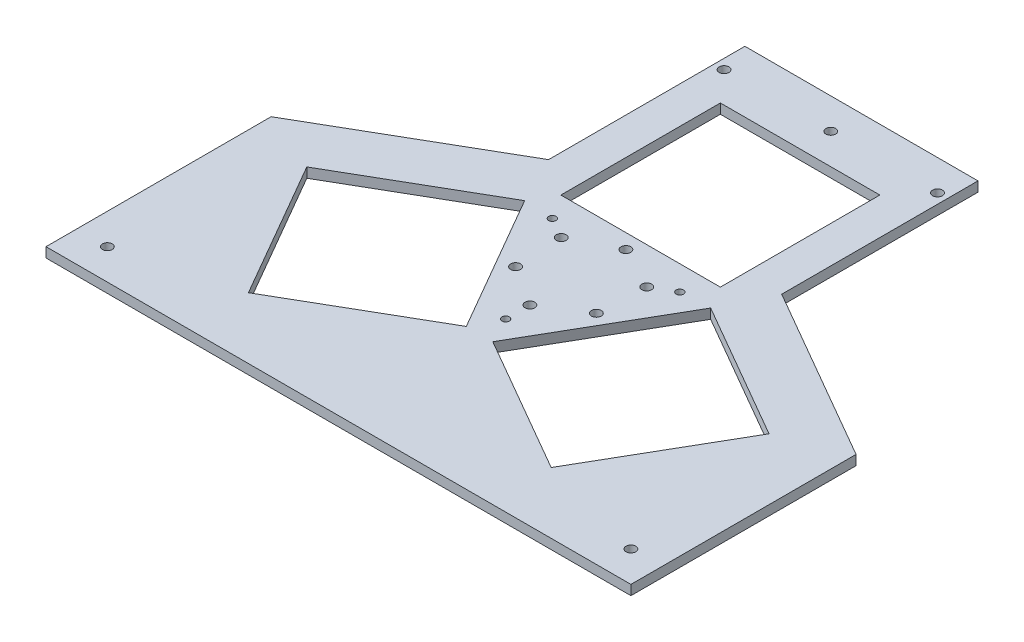
ISO-10303-21;
HEADER;
FILE_DESCRIPTION(('STEP AP214'),'2;1');
FILE_NAME('part.step','',(''),(''),'','','');
FILE_SCHEMA(('AUTOMOTIVE_DESIGN { 1 0 10303 214 1 1 1 1 }'));
ENDSEC;
DATA;
#1=APPLICATION_CONTEXT('core data for automotive mechanical design processes');
#2=APPLICATION_PROTOCOL_DEFINITION('international standard','automotive_design',2000,#1);
#3=PRODUCT_CONTEXT('',#1,'mechanical');
#4=PRODUCT('Part','Part','',(#3));
#5=PRODUCT_RELATED_PRODUCT_CATEGORY('part','',(#4));
#6=PRODUCT_DEFINITION_FORMATION('','',#4);
#7=PRODUCT_DEFINITION_CONTEXT('part definition',#1,'design');
#8=PRODUCT_DEFINITION('design','',#6,#7);
#9=PRODUCT_DEFINITION_SHAPE('','',#8);
#10=(LENGTH_UNIT() NAMED_UNIT(*) SI_UNIT(.MILLI.,.METRE.));
#11=(NAMED_UNIT(*) PLANE_ANGLE_UNIT() SI_UNIT($,.RADIAN.));
#12=(NAMED_UNIT(*) SI_UNIT($,.STERADIAN.) SOLID_ANGLE_UNIT());
#13=UNCERTAINTY_MEASURE_WITH_UNIT(LENGTH_MEASURE(1.E-05),#10,'distance_accuracy_value','');
#14=(GEOMETRIC_REPRESENTATION_CONTEXT(3) GLOBAL_UNCERTAINTY_ASSIGNED_CONTEXT((#13)) GLOBAL_UNIT_ASSIGNED_CONTEXT((#10,
#11,#12)) REPRESENTATION_CONTEXT('',''));
#15=CARTESIAN_POINT('',(0.,0.,0.));
#16=DIRECTION('',(0.,0.,1.));
#17=DIRECTION('',(1.,0.,0.));
#18=AXIS2_PLACEMENT_3D('',#15,#16,#17);
#19=CARTESIAN_POINT('',(0.,4.,0.));
#20=DIRECTION('',(0.,1.,0.));
#21=DIRECTION('',(0.,0.,1.));
#22=AXIS2_PLACEMENT_3D('',#19,#20,#21);
#23=PLANE('',#22);
#24=CARTESIAN_POINT('',(0.,4.,20.125));
#25=DIRECTION('',(0.,1.,0.));
#26=DIRECTION('',(0.,0.,1.));
#27=AXIS2_PLACEMENT_3D('',#24,#25,#26);
#28=CIRCLE('',#27,2.);
#29=CARTESIAN_POINT('',(0.,4.,22.125));
#30=VERTEX_POINT('',#29);
#31=EDGE_CURVE('E548',#30,#30,#28,.T.);
#32=ORIENTED_EDGE('',*,*,#31,.F.);
#33=EDGE_LOOP('',(#32));
#34=FACE_BOUND('',#33,.T.);
#35=CARTESIAN_POINT('',(43.5,4.,-102.5));
#36=DIRECTION('',(0.,1.,0.));
#37=DIRECTION('',(0.,0.,1.));
#38=AXIS2_PLACEMENT_3D('',#35,#36,#37);
#39=CIRCLE('',#38,2.);
#40=CARTESIAN_POINT('',(43.5,4.,-100.5));
#41=VERTEX_POINT('',#40);
#42=EDGE_CURVE('E560',#41,#41,#39,.T.);
#43=ORIENTED_EDGE('',*,*,#42,.F.);
#44=EDGE_LOOP('',(#43));
#45=FACE_BOUND('',#44,.T.);
#46=CARTESIAN_POINT('',(-43.5,4.,-102.5));
#47=DIRECTION('',(0.,1.,0.));
#48=DIRECTION('',(0.,0.,1.));
#49=AXIS2_PLACEMENT_3D('',#46,#47,#48);
#50=CIRCLE('',#49,2.);
#51=CARTESIAN_POINT('',(-43.5,4.,-100.5));
#52=VERTEX_POINT('',#51);
#53=EDGE_CURVE('E572',#52,#52,#50,.T.);
#54=ORIENTED_EDGE('',*,*,#53,.F.);
#55=EDGE_LOOP('',(#54));
#56=FACE_BOUND('',#55,.T.);
#57=CARTESIAN_POINT('',(0.,4.,-102.5));
#58=DIRECTION('',(0.,1.,0.));
#59=DIRECTION('',(0.,0.,1.));
#60=AXIS2_PLACEMENT_3D('',#57,#58,#59);
#61=CIRCLE('',#60,2.);
#62=CARTESIAN_POINT('',(0.,4.,-100.5));
#63=VERTEX_POINT('',#62);
#64=EDGE_CURVE('E202',#63,#63,#61,.T.);
#65=ORIENTED_EDGE('',*,*,#64,.F.);
#66=EDGE_LOOP('',(#65));
#67=FACE_BOUND('',#66,.T.);
#68=DIRECTION('',(0.5,0.,-0.866025403784439));
#69=VECTOR('',#68,1.);
#70=CARTESIAN_POINT('',(94.1922863405995,4.,16.8541743770057));
#71=LINE('',#70,#69);
#72=CARTESIAN_POINT('',(61.6922863405995,4.,73.1458256229942));
#73=VERTEX_POINT('',#72);
#74=CARTESIAN_POINT('',(94.1922863405995,4.,16.8541743770057));
#75=VERTEX_POINT('',#74);
#76=EDGE_CURVE('E251',#73,#75,#71,.T.);
#77=ORIENTED_EDGE('',*,*,#76,.F.);
#78=DIRECTION('',(0.866025403784439,0.,0.5));
#79=VECTOR('',#78,1.);
#80=CARTESIAN_POINT('',(61.6922863405995,4.,73.1458256229942));
#81=LINE('',#80,#79);
#82=CARTESIAN_POINT('',(5.40063509461098,4.,40.6458256229943));
#83=VERTEX_POINT('',#82);
#84=EDGE_CURVE('E249',#83,#73,#81,.T.);
#85=ORIENTED_EDGE('',*,*,#84,.F.);
#86=DIRECTION('',(-0.5,0.,0.866025403784439));
#87=VECTOR('',#86,1.);
#88=CARTESIAN_POINT('',(37.900635094611,4.,-15.6458256229943));
#89=LINE('',#88,#87);
#90=CARTESIAN_POINT('',(37.900635094611,4.,-15.6458256229943));
#91=VERTEX_POINT('',#90);
#92=EDGE_CURVE('E257',#91,#83,#89,.T.);
#93=ORIENTED_EDGE('',*,*,#92,.F.);
#94=DIRECTION('',(-0.866025403784439,0.,-0.5));
#95=VECTOR('',#94,1.);
#96=CARTESIAN_POINT('',(94.1922863405995,4.,16.8541743770057));
#97=LINE('',#96,#95);
#98=EDGE_CURVE('E254',#75,#91,#97,.T.);
#99=ORIENTED_EDGE('',*,*,#98,.F.);
#100=EDGE_LOOP('',(#77,#85,#93,#99));
#101=FACE_BOUND('',#100,.T.);
#102=CARTESIAN_POINT('',(-16.4544826719043,4.,9.50000000000013));
#103=DIRECTION('',(0.,1.,0.));
#104=DIRECTION('',(0.,0.,1.));
#105=AXIS2_PLACEMENT_3D('',#102,#103,#104);
#106=CIRCLE('',#105,1.99999999999997);
#107=CARTESIAN_POINT('',(-16.4544826719043,4.,11.5000000000001));
#108=VERTEX_POINT('',#107);
#109=EDGE_CURVE('E280',#108,#108,#106,.T.);
#110=ORIENTED_EDGE('',*,*,#109,.F.);
#111=EDGE_LOOP('',(#110));
#112=FACE_BOUND('',#111,.T.);
#113=CARTESIAN_POINT('',(16.4544826719044,4.,9.49999999999995));
#114=DIRECTION('',(0.,1.,0.));
#115=DIRECTION('',(0.,0.,1.));
#116=AXIS2_PLACEMENT_3D('',#113,#114,#115);
#117=CIRCLE('',#116,1.99999999999992);
#118=CARTESIAN_POINT('',(16.4544826719044,4.,11.4999999999999));
#119=VERTEX_POINT('',#118);
#120=EDGE_CURVE('E292',#119,#119,#117,.T.);
#121=ORIENTED_EDGE('',*,*,#120,.F.);
#122=EDGE_LOOP('',(#121));
#123=FACE_BOUND('',#122,.T.);
#124=CARTESIAN_POINT('',(0.,4.,-19.));
#125=DIRECTION('',(0.,1.,0.));
#126=DIRECTION('',(0.,0.,1.));
#127=AXIS2_PLACEMENT_3D('',#124,#125,#126);
#128=CIRCLE('',#127,2.);
#129=CARTESIAN_POINT('',(0.,4.,-17.));
#130=VERTEX_POINT('',#129);
#131=EDGE_CURVE('E304',#130,#130,#128,.T.);
#132=ORIENTED_EDGE('',*,*,#131,.F.);
#133=EDGE_LOOP('',(#132));
#134=FACE_BOUND('',#133,.T.);
#135=DIRECTION('',(0.,0.,1.));
#136=VECTOR('',#135,1.);
#137=CARTESIAN_POINT('',(-47.5,4.,-115.));
#138=LINE('',#137,#136);
#139=CARTESIAN_POINT('',(-47.5,4.,-115.));
#140=VERTEX_POINT('',#139);
#141=CARTESIAN_POINT('',(-47.5,4.,-35.));
#142=VERTEX_POINT('',#141);
#143=EDGE_CURVE('E310',#140,#142,#138,.T.);
#144=ORIENTED_EDGE('',*,*,#143,.T.);
#145=DIRECTION('',(-0.86602540378444,0.,0.499999999999998));
#146=VECTOR('',#145,1.);
#147=CARTESIAN_POINT('',(-47.5,4.,-35.));
#148=LINE('',#147,#146);
#149=CARTESIAN_POINT('',(-119.192286340599,4.,6.39156081756467));
#150=VERTEX_POINT('',#149);
#151=EDGE_CURVE('E313',#142,#150,#148,.T.);
#152=ORIENTED_EDGE('',*,*,#151,.T.);
#153=DIRECTION('',(0.,0.,1.));
#154=VECTOR('',#153,1.);
#155=CARTESIAN_POINT('',(-119.192286340599,4.,98.1458256229943));
#156=LINE('',#155,#154);
#157=CARTESIAN_POINT('',(-119.192286340599,4.,98.1458256229943));
#158=VERTEX_POINT('',#157);
#159=EDGE_CURVE('E316',#150,#158,#156,.T.);
#160=ORIENTED_EDGE('',*,*,#159,.T.);
#161=DIRECTION('',(1.,0.,0.));
#162=VECTOR('',#161,1.);
#163=CARTESIAN_POINT('',(-119.192286340599,4.,98.1458256229943));
#164=LINE('',#163,#162);
#165=CARTESIAN_POINT('',(119.192286340599,4.,98.1458256229943));
#166=VERTEX_POINT('',#165);
#167=EDGE_CURVE('E318',#158,#166,#164,.T.);
#168=ORIENTED_EDGE('',*,*,#167,.T.);
#169=DIRECTION('',(0.,0.,-1.));
#170=VECTOR('',#169,1.);
#171=CARTESIAN_POINT('',(119.192286340599,4.,98.1458256229943));
#172=LINE('',#171,#170);
#173=CARTESIAN_POINT('',(119.192286340599,4.,6.39156081756465));
#174=VERTEX_POINT('',#173);
#175=EDGE_CURVE('E320',#166,#174,#172,.T.);
#176=ORIENTED_EDGE('',*,*,#175,.T.);
#177=DIRECTION('',(-0.86602540378444,0.,-0.499999999999998));
#178=VECTOR('',#177,1.);
#179=CARTESIAN_POINT('',(47.5,4.,-35.));
#180=LINE('',#179,#178);
#181=CARTESIAN_POINT('',(47.5,4.,-35.));
#182=VERTEX_POINT('',#181);
#183=EDGE_CURVE('E322',#174,#182,#180,.T.);
#184=ORIENTED_EDGE('',*,*,#183,.T.);
#185=DIRECTION('',(0.,0.,-1.));
#186=VECTOR('',#185,1.);
#187=CARTESIAN_POINT('',(47.5,4.,-115.));
#188=LINE('',#187,#186);
#189=CARTESIAN_POINT('',(47.5,4.,-115.));
#190=VERTEX_POINT('',#189);
#191=EDGE_CURVE('E324',#182,#190,#188,.T.);
#192=ORIENTED_EDGE('',*,*,#191,.T.);
#193=DIRECTION('',(-1.,0.,0.));
#194=VECTOR('',#193,1.);
#195=CARTESIAN_POINT('',(47.5,4.,-115.));
#196=LINE('',#195,#194);
#197=EDGE_CURVE('E326',#190,#140,#196,.T.);
#198=ORIENTED_EDGE('',*,*,#197,.T.);
#199=EDGE_LOOP('',(#144,#152,#160,#168,#176,#184,#192,#198));
#200=FACE_BOUND('',#199,.T.);
#201=CARTESIAN_POINT('',(25.9807621135333,4.,-15.));
#202=DIRECTION('',(0.,1.,0.));
#203=DIRECTION('',(0.,0.,1.));
#204=AXIS2_PLACEMENT_3D('',#201,#202,#203);
#205=CIRCLE('',#204,1.49999999999942);
#206=CARTESIAN_POINT('',(25.9807621135333,4.,-13.5000000000005));
#207=VERTEX_POINT('',#206);
#208=EDGE_CURVE('E298',#207,#207,#205,.T.);
#209=ORIENTED_EDGE('',*,*,#208,.F.);
#210=EDGE_LOOP('',(#209));
#211=FACE_BOUND('',#210,.T.);
#212=CARTESIAN_POINT('',(0.,4.,29.9999999999995));
#213=DIRECTION('',(0.,1.,0.));
#214=DIRECTION('',(0.,0.,1.));
#215=AXIS2_PLACEMENT_3D('',#212,#213,#214);
#216=CIRCLE('',#215,1.5);
#217=CARTESIAN_POINT('',(0.,4.,31.4999999999995));
#218=VERTEX_POINT('',#217);
#219=EDGE_CURVE('E286',#218,#218,#216,.T.);
#220=ORIENTED_EDGE('',*,*,#219,.F.);
#221=EDGE_LOOP('',(#220));
#222=FACE_BOUND('',#221,.T.);
#223=CARTESIAN_POINT('',(-25.9807621135331,4.,-15.0000000000001));
#224=DIRECTION('',(0.,1.,0.));
#225=DIRECTION('',(0.,0.,1.));
#226=AXIS2_PLACEMENT_3D('',#223,#224,#225);
#227=CIRCLE('',#226,1.5);
#228=CARTESIAN_POINT('',(-25.9807621135331,4.,-13.5000000000001));
#229=VERTEX_POINT('',#228);
#230=EDGE_CURVE('E243',#229,#229,#227,.T.);
#231=ORIENTED_EDGE('',*,*,#230,.F.);
#232=EDGE_LOOP('',(#231));
#233=FACE_BOUND('',#232,.T.);
#234=DIRECTION('',(-1.,0.,0.));
#235=VECTOR('',#234,1.);
#236=CARTESIAN_POINT('',(-32.5,4.,-90.));
#237=LINE('',#236,#235);
#238=CARTESIAN_POINT('',(32.5,4.,-90.));
#239=VERTEX_POINT('',#238);
#240=CARTESIAN_POINT('',(-32.5,4.,-90.));
#241=VERTEX_POINT('',#240);
#242=EDGE_CURVE('E214',#239,#241,#237,.T.);
#243=ORIENTED_EDGE('',*,*,#242,.F.);
#244=DIRECTION('',(0.,0.,-1.));
#245=VECTOR('',#244,1.);
#246=CARTESIAN_POINT('',(32.5,4.,-90.));
#247=LINE('',#246,#245);
#248=CARTESIAN_POINT('',(32.5,4.,-25.));
#249=VERTEX_POINT('',#248);
#250=EDGE_CURVE('E212',#249,#239,#247,.T.);
#251=ORIENTED_EDGE('',*,*,#250,.F.);
#252=DIRECTION('',(1.,0.,0.));
#253=VECTOR('',#252,1.);
#254=CARTESIAN_POINT('',(-32.5,4.,-25.));
#255=LINE('',#254,#253);
#256=CARTESIAN_POINT('',(-32.5,4.,-25.));
#257=VERTEX_POINT('',#256);
#258=EDGE_CURVE('E220',#257,#249,#255,.T.);
#259=ORIENTED_EDGE('',*,*,#258,.F.);
#260=DIRECTION('',(0.,0.,1.));
#261=VECTOR('',#260,1.);
#262=CARTESIAN_POINT('',(-32.5,4.,-90.));
#263=LINE('',#262,#261);
#264=EDGE_CURVE('E217',#241,#257,#263,.T.);
#265=ORIENTED_EDGE('',*,*,#264,.F.);
#266=EDGE_LOOP('',(#243,#251,#259,#265));
#267=FACE_BOUND('',#266,.T.);
#268=DIRECTION('',(0.5,0.,0.866025403784438));
#269=VECTOR('',#268,1.);
#270=CARTESIAN_POINT('',(-61.6922863405995,4.,73.1458256229943));
#271=LINE('',#270,#269);
#272=CARTESIAN_POINT('',(-94.1922863405995,4.,16.8541743770058));
#273=VERTEX_POINT('',#272);
#274=CARTESIAN_POINT('',(-61.6922863405995,4.,73.1458256229943));
#275=VERTEX_POINT('',#274);
#276=EDGE_CURVE('E181',#273,#275,#271,.T.);
#277=ORIENTED_EDGE('',*,*,#276,.F.);
#278=DIRECTION('',(-0.866025403784438,0.,0.500000000000001));
#279=VECTOR('',#278,1.);
#280=CARTESIAN_POINT('',(-94.1922863405995,4.,16.8541743770058));
#281=LINE('',#280,#279);
#282=CARTESIAN_POINT('',(-37.900635094611,4.,-15.6458256229942));
#283=VERTEX_POINT('',#282);
#284=EDGE_CURVE('E173',#283,#273,#281,.T.);
#285=ORIENTED_EDGE('',*,*,#284,.F.);
#286=DIRECTION('',(-0.500000000000001,0.,-0.866025403784438));
#287=VECTOR('',#286,1.);
#288=CARTESIAN_POINT('',(-5.40063509461094,4.,40.6458256229943));
#289=LINE('',#288,#287);
#290=CARTESIAN_POINT('',(-5.40063509461095,4.,40.6458256229943));
#291=VERTEX_POINT('',#290);
#292=EDGE_CURVE('E196',#291,#283,#289,.T.);
#293=ORIENTED_EDGE('',*,*,#292,.F.);
#294=DIRECTION('',(0.866025403784438,0.,-0.5));
#295=VECTOR('',#294,1.);
#296=CARTESIAN_POINT('',(-61.6922863405995,4.,73.1458256229943));
#297=LINE('',#296,#295);
#298=EDGE_CURVE('E194',#275,#291,#297,.T.);
#299=ORIENTED_EDGE('',*,*,#298,.F.);
#300=EDGE_LOOP('',(#277,#285,#293,#299));
#301=FACE_BOUND('',#300,.T.);
#302=CARTESIAN_POINT('',(-106.692286340599,4.,85.6458256229943));
#303=DIRECTION('',(0.,1.,0.));
#304=DIRECTION('',(0.,0.,1.));
#305=AXIS2_PLACEMENT_3D('',#302,#303,#304);
#306=CIRCLE('',#305,2.);
#307=CARTESIAN_POINT('',(-106.692286340599,4.,87.6458256229943));
#308=VERTEX_POINT('',#307);
#309=EDGE_CURVE('E578',#308,#308,#306,.T.);
#310=ORIENTED_EDGE('',*,*,#309,.F.);
#311=EDGE_LOOP('',(#310));
#312=FACE_BOUND('',#311,.T.);
#313=CARTESIAN_POINT('',(106.6922863406,4.,85.6458256229943));
#314=DIRECTION('',(0.,1.,0.));
#315=DIRECTION('',(0.,0.,1.));
#316=AXIS2_PLACEMENT_3D('',#313,#314,#315);
#317=CIRCLE('',#316,2.);
#318=CARTESIAN_POINT('',(106.6922863406,4.,87.6458256229943));
#319=VERTEX_POINT('',#318);
#320=EDGE_CURVE('E566',#319,#319,#317,.T.);
#321=ORIENTED_EDGE('',*,*,#320,.F.);
#322=EDGE_LOOP('',(#321));
#323=FACE_BOUND('',#322,.T.);
#324=CARTESIAN_POINT('',(17.4287612511618,4.,-10.0625));
#325=DIRECTION('',(0.,1.,0.));
#326=DIRECTION('',(0.,0.,1.));
#327=AXIS2_PLACEMENT_3D('',#324,#325,#326);
#328=CIRCLE('',#327,2.);
#329=CARTESIAN_POINT('',(17.4287612511618,4.,-8.0625));
#330=VERTEX_POINT('',#329);
#331=EDGE_CURVE('E554',#330,#330,#328,.T.);
#332=ORIENTED_EDGE('',*,*,#331,.F.);
#333=EDGE_LOOP('',(#332));
#334=FACE_BOUND('',#333,.T.);
#335=CARTESIAN_POINT('',(-17.4287612511618,4.,-10.0625));
#336=DIRECTION('',(0.,1.,0.));
#337=DIRECTION('',(0.,0.,1.));
#338=AXIS2_PLACEMENT_3D('',#335,#336,#337);
#339=CIRCLE('',#338,2.);
#340=CARTESIAN_POINT('',(-17.4287612511618,4.,-8.06249999999999));
#341=VERTEX_POINT('',#340);
#342=EDGE_CURVE('E539',#341,#341,#339,.T.);
#343=ORIENTED_EDGE('',*,*,#342,.F.);
#344=EDGE_LOOP('',(#343));
#345=FACE_BOUND('',#344,.T.);
#346=ADVANCED_FACE('F36',(#34,#45,#56,#67,#101,#112,#123,#134,#200,#211,#222,#233,#267,#301,
#312,#323,#334,#345),#23,.T.);
#347=CARTESIAN_POINT('',(0.,0.,0.));
#348=DIRECTION('',(0.,1.,0.));
#349=DIRECTION('',(0.,0.,1.));
#350=AXIS2_PLACEMENT_3D('',#347,#348,#349);
#351=PLANE('',#350);
#352=DIRECTION('',(0.,0.,-1.));
#353=VECTOR('',#352,1.);
#354=CARTESIAN_POINT('',(32.5,0.,-90.));
#355=LINE('',#354,#353);
#356=CARTESIAN_POINT('',(32.5,0.,-25.));
#357=VERTEX_POINT('',#356);
#358=CARTESIAN_POINT('',(32.5,0.,-90.));
#359=VERTEX_POINT('',#358);
#360=EDGE_CURVE('E189',#357,#359,#355,.T.);
#361=ORIENTED_EDGE('',*,*,#360,.T.);
#362=DIRECTION('',(-1.,0.,0.));
#363=VECTOR('',#362,1.);
#364=CARTESIAN_POINT('',(-32.5,0.,-90.));
#365=LINE('',#364,#363);
#366=CARTESIAN_POINT('',(-32.5,0.,-90.));
#367=VERTEX_POINT('',#366);
#368=EDGE_CURVE('E225',#359,#367,#365,.T.);
#369=ORIENTED_EDGE('',*,*,#368,.T.);
#370=DIRECTION('',(0.,0.,1.));
#371=VECTOR('',#370,1.);
#372=CARTESIAN_POINT('',(-32.5,0.,-90.));
#373=LINE('',#372,#371);
#374=CARTESIAN_POINT('',(-32.5,0.,-25.));
#375=VERTEX_POINT('',#374);
#376=EDGE_CURVE('E228',#367,#375,#373,.T.);
#377=ORIENTED_EDGE('',*,*,#376,.T.);
#378=DIRECTION('',(1.,0.,0.));
#379=VECTOR('',#378,1.);
#380=CARTESIAN_POINT('',(-32.5,0.,-25.));
#381=LINE('',#380,#379);
#382=EDGE_CURVE('E215',#375,#357,#381,.T.);
#383=ORIENTED_EDGE('',*,*,#382,.T.);
#384=EDGE_LOOP('',(#361,#369,#377,#383));
#385=FACE_BOUND('',#384,.T.);
#386=CARTESIAN_POINT('',(-16.4544826719043,0.,9.50000000000013));
#387=DIRECTION('',(0.,1.,0.));
#388=DIRECTION('',(0.,0.,1.));
#389=AXIS2_PLACEMENT_3D('',#386,#387,#388);
#390=CIRCLE('',#389,1.99999999999997);
#391=CARTESIAN_POINT('',(-16.4544826719043,0.,11.5000000000001));
#392=VERTEX_POINT('',#391);
#393=EDGE_CURVE('E279',#392,#392,#390,.T.);
#394=ORIENTED_EDGE('',*,*,#393,.T.);
#395=EDGE_LOOP('',(#394));
#396=FACE_BOUND('',#395,.T.);
#397=CARTESIAN_POINT('',(0.,0.,29.9999999999995));
#398=DIRECTION('',(0.,1.,0.));
#399=DIRECTION('',(0.,0.,1.));
#400=AXIS2_PLACEMENT_3D('',#397,#398,#399);
#401=CIRCLE('',#400,1.5);
#402=CARTESIAN_POINT('',(0.,0.,31.4999999999995));
#403=VERTEX_POINT('',#402);
#404=EDGE_CURVE('E283',#403,#403,#401,.T.);
#405=ORIENTED_EDGE('',*,*,#404,.T.);
#406=EDGE_LOOP('',(#405));
#407=FACE_BOUND('',#406,.T.);
#408=CARTESIAN_POINT('',(16.4544826719044,0.,9.49999999999995));
#409=DIRECTION('',(0.,1.,0.));
#410=DIRECTION('',(0.,0.,1.));
#411=AXIS2_PLACEMENT_3D('',#408,#409,#410);
#412=CIRCLE('',#411,1.99999999999992);
#413=CARTESIAN_POINT('',(16.4544826719044,0.,11.4999999999999));
#414=VERTEX_POINT('',#413);
#415=EDGE_CURVE('E289',#414,#414,#412,.T.);
#416=ORIENTED_EDGE('',*,*,#415,.T.);
#417=EDGE_LOOP('',(#416));
#418=FACE_BOUND('',#417,.T.);
#419=CARTESIAN_POINT('',(25.9807621135333,0.,-15.));
#420=DIRECTION('',(0.,1.,0.));
#421=DIRECTION('',(0.,0.,1.));
#422=AXIS2_PLACEMENT_3D('',#419,#420,#421);
#423=CIRCLE('',#422,1.49999999999942);
#424=CARTESIAN_POINT('',(25.9807621135333,0.,-13.5000000000005));
#425=VERTEX_POINT('',#424);
#426=EDGE_CURVE('E295',#425,#425,#423,.T.);
#427=ORIENTED_EDGE('',*,*,#426,.T.);
#428=EDGE_LOOP('',(#427));
#429=FACE_BOUND('',#428,.T.);
#430=CARTESIAN_POINT('',(0.,0.,-19.));
#431=DIRECTION('',(0.,1.,0.));
#432=DIRECTION('',(0.,0.,1.));
#433=AXIS2_PLACEMENT_3D('',#430,#431,#432);
#434=CIRCLE('',#433,2.);
#435=CARTESIAN_POINT('',(0.,0.,-17.));
#436=VERTEX_POINT('',#435);
#437=EDGE_CURVE('E301',#436,#436,#434,.T.);
#438=ORIENTED_EDGE('',*,*,#437,.T.);
#439=EDGE_LOOP('',(#438));
#440=FACE_BOUND('',#439,.T.);
#441=DIRECTION('',(0.,0.,1.));
#442=VECTOR('',#441,1.);
#443=CARTESIAN_POINT('',(-47.5,0.,-115.));
#444=LINE('',#443,#442);
#445=CARTESIAN_POINT('',(-47.5,0.,-115.));
#446=VERTEX_POINT('',#445);
#447=CARTESIAN_POINT('',(-47.5,0.,-35.));
#448=VERTEX_POINT('',#447);
#449=EDGE_CURVE('E307',#446,#448,#444,.T.);
#450=ORIENTED_EDGE('',*,*,#449,.F.);
#451=DIRECTION('',(-1.,0.,0.));
#452=VECTOR('',#451,1.);
#453=CARTESIAN_POINT('',(47.5,0.,-115.));
#454=LINE('',#453,#452);
#455=CARTESIAN_POINT('',(47.5,0.,-115.));
#456=VERTEX_POINT('',#455);
#457=EDGE_CURVE('E314',#456,#446,#454,.T.);
#458=ORIENTED_EDGE('',*,*,#457,.F.);
#459=DIRECTION('',(0.,0.,-1.));
#460=VECTOR('',#459,1.);
#461=CARTESIAN_POINT('',(47.5,0.,-115.));
#462=LINE('',#461,#460);
#463=CARTESIAN_POINT('',(47.5,0.,-35.));
#464=VERTEX_POINT('',#463);
#465=EDGE_CURVE('E341',#464,#456,#462,.T.);
#466=ORIENTED_EDGE('',*,*,#465,.F.);
#467=DIRECTION('',(-0.86602540378444,0.,-0.499999999999998));
#468=VECTOR('',#467,1.);
#469=CARTESIAN_POINT('',(47.5,0.,-35.));
#470=LINE('',#469,#468);
#471=CARTESIAN_POINT('',(119.192286340599,0.,6.39156081756465));
#472=VERTEX_POINT('',#471);
#473=EDGE_CURVE('E339',#472,#464,#470,.T.);
#474=ORIENTED_EDGE('',*,*,#473,.F.);
#475=DIRECTION('',(0.,0.,-1.));
#476=VECTOR('',#475,1.);
#477=CARTESIAN_POINT('',(119.192286340599,0.,98.1458256229943));
#478=LINE('',#477,#476);
#479=CARTESIAN_POINT('',(119.192286340599,0.,98.1458256229943));
#480=VERTEX_POINT('',#479);
#481=EDGE_CURVE('E337',#480,#472,#478,.T.);
#482=ORIENTED_EDGE('',*,*,#481,.F.);
#483=DIRECTION('',(1.,0.,0.));
#484=VECTOR('',#483,1.);
#485=CARTESIAN_POINT('',(-119.192286340599,0.,98.1458256229943));
#486=LINE('',#485,#484);
#487=CARTESIAN_POINT('',(-119.192286340599,0.,98.1458256229943));
#488=VERTEX_POINT('',#487);
#489=EDGE_CURVE('E335',#488,#480,#486,.T.);
#490=ORIENTED_EDGE('',*,*,#489,.F.);
#491=DIRECTION('',(0.,0.,1.));
#492=VECTOR('',#491,1.);
#493=CARTESIAN_POINT('',(-119.192286340599,0.,98.1458256229943));
#494=LINE('',#493,#492);
#495=CARTESIAN_POINT('',(-119.192286340599,0.,6.39156081756467));
#496=VERTEX_POINT('',#495);
#497=EDGE_CURVE('E333',#496,#488,#494,.T.);
#498=ORIENTED_EDGE('',*,*,#497,.F.);
#499=DIRECTION('',(-0.86602540378444,0.,0.499999999999998));
#500=VECTOR('',#499,1.);
#501=CARTESIAN_POINT('',(-47.5,0.,-35.));
#502=LINE('',#501,#500);
#503=EDGE_CURVE('E331',#448,#496,#502,.T.);
#504=ORIENTED_EDGE('',*,*,#503,.F.);
#505=EDGE_LOOP('',(#450,#458,#466,#474,#482,#490,#498,#504));
#506=FACE_BOUND('',#505,.T.);
#507=DIRECTION('',(0.866025403784439,0.,0.5));
#508=VECTOR('',#507,1.);
#509=CARTESIAN_POINT('',(61.6922863405995,0.,73.1458256229942));
#510=LINE('',#509,#508);
#511=CARTESIAN_POINT('',(5.40063509461098,0.,40.6458256229943));
#512=VERTEX_POINT('',#511);
#513=CARTESIAN_POINT('',(61.6922863405995,0.,73.1458256229942));
#514=VERTEX_POINT('',#513);
#515=EDGE_CURVE('E246',#512,#514,#510,.T.);
#516=ORIENTED_EDGE('',*,*,#515,.T.);
#517=DIRECTION('',(0.5,0.,-0.866025403784439));
#518=VECTOR('',#517,1.);
#519=CARTESIAN_POINT('',(94.1922863405995,0.,16.8541743770057));
#520=LINE('',#519,#518);
#521=CARTESIAN_POINT('',(94.1922863405995,0.,16.8541743770057));
#522=VERTEX_POINT('',#521);
#523=EDGE_CURVE('E262',#514,#522,#520,.T.);
#524=ORIENTED_EDGE('',*,*,#523,.T.);
#525=DIRECTION('',(-0.866025403784439,0.,-0.5));
#526=VECTOR('',#525,1.);
#527=CARTESIAN_POINT('',(94.1922863405995,0.,16.8541743770057));
#528=LINE('',#527,#526);
#529=CARTESIAN_POINT('',(37.900635094611,0.,-15.6458256229943));
#530=VERTEX_POINT('',#529);
#531=EDGE_CURVE('E265',#522,#530,#528,.T.);
#532=ORIENTED_EDGE('',*,*,#531,.T.);
#533=DIRECTION('',(-0.5,0.,0.866025403784439));
#534=VECTOR('',#533,1.);
#535=CARTESIAN_POINT('',(37.900635094611,0.,-15.6458256229943));
#536=LINE('',#535,#534);
#537=EDGE_CURVE('E252',#530,#512,#536,.T.);
#538=ORIENTED_EDGE('',*,*,#537,.T.);
#539=EDGE_LOOP('',(#516,#524,#532,#538));
#540=FACE_BOUND('',#539,.T.);
#541=CARTESIAN_POINT('',(-25.9807621135331,0.,-15.0000000000001));
#542=DIRECTION('',(0.,1.,0.));
#543=DIRECTION('',(0.,0.,1.));
#544=AXIS2_PLACEMENT_3D('',#541,#542,#543);
#545=CIRCLE('',#544,1.5);
#546=CARTESIAN_POINT('',(-25.9807621135331,0.,-13.5000000000001));
#547=VERTEX_POINT('',#546);
#548=EDGE_CURVE('E242',#547,#547,#545,.T.);
#549=ORIENTED_EDGE('',*,*,#548,.T.);
#550=EDGE_LOOP('',(#549));
#551=FACE_BOUND('',#550,.T.);
#552=DIRECTION('',(-0.866025403784438,0.,0.500000000000001));
#553=VECTOR('',#552,1.);
#554=CARTESIAN_POINT('',(-94.1922863405995,0.,16.8541743770058));
#555=LINE('',#554,#553);
#556=CARTESIAN_POINT('',(-37.900635094611,0.,-15.6458256229942));
#557=VERTEX_POINT('',#556);
#558=CARTESIAN_POINT('',(-94.1922863405995,0.,16.8541743770058));
#559=VERTEX_POINT('',#558);
#560=EDGE_CURVE('E59',#557,#559,#555,.T.);
#561=ORIENTED_EDGE('',*,*,#560,.T.);
#562=DIRECTION('',(0.5,0.,0.866025403784438));
#563=VECTOR('',#562,1.);
#564=CARTESIAN_POINT('',(-61.6922863405995,0.,73.1458256229943));
#565=LINE('',#564,#563);
#566=CARTESIAN_POINT('',(-61.6922863405995,0.,73.1458256229943));
#567=VERTEX_POINT('',#566);
#568=EDGE_CURVE('E188',#559,#567,#565,.T.);
#569=ORIENTED_EDGE('',*,*,#568,.T.);
#570=DIRECTION('',(0.866025403784438,0.,-0.5));
#571=VECTOR('',#570,1.);
#572=CARTESIAN_POINT('',(-61.6922863405995,0.,73.1458256229943));
#573=LINE('',#572,#571);
#574=CARTESIAN_POINT('',(-5.40063509461094,0.,40.6458256229943));
#575=VERTEX_POINT('',#574);
#576=EDGE_CURVE('E204',#567,#575,#573,.T.);
#577=ORIENTED_EDGE('',*,*,#576,.T.);
#578=DIRECTION('',(-0.500000000000001,0.,-0.866025403784438));
#579=VECTOR('',#578,1.);
#580=CARTESIAN_POINT('',(-5.40063509461094,0.,40.6458256229943));
#581=LINE('',#580,#579);
#582=EDGE_CURVE('E182',#575,#557,#581,.T.);
#583=ORIENTED_EDGE('',*,*,#582,.T.);
#584=EDGE_LOOP('',(#561,#569,#577,#583));
#585=FACE_BOUND('',#584,.T.);
#586=CARTESIAN_POINT('',(0.,0.,-102.5));
#587=DIRECTION('',(0.,1.,0.));
#588=DIRECTION('',(0.,0.,1.));
#589=AXIS2_PLACEMENT_3D('',#586,#587,#588);
#590=CIRCLE('',#589,2.);
#591=CARTESIAN_POINT('',(0.,0.,-100.5));
#592=VERTEX_POINT('',#591);
#593=EDGE_CURVE('E581',#592,#592,#590,.T.);
#594=ORIENTED_EDGE('',*,*,#593,.T.);
#595=EDGE_LOOP('',(#594));
#596=FACE_BOUND('',#595,.T.);
#597=CARTESIAN_POINT('',(-106.692286340599,0.,85.6458256229943));
#598=DIRECTION('',(0.,1.,0.));
#599=DIRECTION('',(0.,0.,1.));
#600=AXIS2_PLACEMENT_3D('',#597,#598,#599);
#601=CIRCLE('',#600,2.);
#602=CARTESIAN_POINT('',(-106.692286340599,0.,87.6458256229943));
#603=VERTEX_POINT('',#602);
#604=EDGE_CURVE('E575',#603,#603,#601,.T.);
#605=ORIENTED_EDGE('',*,*,#604,.T.);
#606=EDGE_LOOP('',(#605));
#607=FACE_BOUND('',#606,.T.);
#608=CARTESIAN_POINT('',(-43.5,0.,-102.5));
#609=DIRECTION('',(0.,1.,0.));
#610=DIRECTION('',(0.,0.,1.));
#611=AXIS2_PLACEMENT_3D('',#608,#609,#610);
#612=CIRCLE('',#611,2.);
#613=CARTESIAN_POINT('',(-43.5,0.,-100.5));
#614=VERTEX_POINT('',#613);
#615=EDGE_CURVE('E569',#614,#614,#612,.T.);
#616=ORIENTED_EDGE('',*,*,#615,.T.);
#617=EDGE_LOOP('',(#616));
#618=FACE_BOUND('',#617,.T.);
#619=CARTESIAN_POINT('',(106.6922863406,0.,85.6458256229943));
#620=DIRECTION('',(0.,1.,0.));
#621=DIRECTION('',(0.,0.,1.));
#622=AXIS2_PLACEMENT_3D('',#619,#620,#621);
#623=CIRCLE('',#622,2.);
#624=CARTESIAN_POINT('',(106.6922863406,0.,87.6458256229943));
#625=VERTEX_POINT('',#624);
#626=EDGE_CURVE('E563',#625,#625,#623,.T.);
#627=ORIENTED_EDGE('',*,*,#626,.T.);
#628=EDGE_LOOP('',(#627));
#629=FACE_BOUND('',#628,.T.);
#630=CARTESIAN_POINT('',(43.5,0.,-102.5));
#631=DIRECTION('',(0.,1.,0.));
#632=DIRECTION('',(0.,0.,1.));
#633=AXIS2_PLACEMENT_3D('',#630,#631,#632);
#634=CIRCLE('',#633,2.);
#635=CARTESIAN_POINT('',(43.5,0.,-100.5));
#636=VERTEX_POINT('',#635);
#637=EDGE_CURVE('E557',#636,#636,#634,.T.);
#638=ORIENTED_EDGE('',*,*,#637,.T.);
#639=EDGE_LOOP('',(#638));
#640=FACE_BOUND('',#639,.T.);
#641=CARTESIAN_POINT('',(17.4287612511618,0.,-10.0625));
#642=DIRECTION('',(0.,1.,0.));
#643=DIRECTION('',(0.,0.,1.));
#644=AXIS2_PLACEMENT_3D('',#641,#642,#643);
#645=CIRCLE('',#644,2.);
#646=CARTESIAN_POINT('',(17.4287612511618,0.,-8.0625));
#647=VERTEX_POINT('',#646);
#648=EDGE_CURVE('E551',#647,#647,#645,.T.);
#649=ORIENTED_EDGE('',*,*,#648,.T.);
#650=EDGE_LOOP('',(#649));
#651=FACE_BOUND('',#650,.T.);
#652=CARTESIAN_POINT('',(0.,0.,20.125));
#653=DIRECTION('',(0.,1.,0.));
#654=DIRECTION('',(0.,0.,1.));
#655=AXIS2_PLACEMENT_3D('',#652,#653,#654);
#656=CIRCLE('',#655,2.);
#657=CARTESIAN_POINT('',(0.,0.,22.125));
#658=VERTEX_POINT('',#657);
#659=EDGE_CURVE('E545',#658,#658,#656,.T.);
#660=ORIENTED_EDGE('',*,*,#659,.T.);
#661=EDGE_LOOP('',(#660));
#662=FACE_BOUND('',#661,.T.);
#663=CARTESIAN_POINT('',(-17.4287612511618,0.,-10.0625));
#664=DIRECTION('',(0.,1.,0.));
#665=DIRECTION('',(0.,0.,1.));
#666=AXIS2_PLACEMENT_3D('',#663,#664,#665);
#667=CIRCLE('',#666,2.);
#668=CARTESIAN_POINT('',(-17.4287612511618,0.,-8.06249999999999));
#669=VERTEX_POINT('',#668);
#670=EDGE_CURVE('E542',#669,#669,#667,.T.);
#671=ORIENTED_EDGE('',*,*,#670,.T.);
#672=EDGE_LOOP('',(#671));
#673=FACE_BOUND('',#672,.T.);
#674=ADVANCED_FACE('F371',(#385,#396,#407,#418,#429,#440,#506,#540,#551,#585,#596,#607,#618,
#629,#640,#651,#662,#673),#351,.F.);
#675=CARTESIAN_POINT('',(-47.5,4.,-115.));
#676=DIRECTION('',(1.,0.,0.));
#677=DIRECTION('',(0.,0.,-1.));
#678=AXIS2_PLACEMENT_3D('',#675,#676,#677);
#679=PLANE('',#678);
#680=ORIENTED_EDGE('',*,*,#449,.T.);
#681=DIRECTION('',(0.,-1.,0.));
#682=VECTOR('',#681,1.);
#683=CARTESIAN_POINT('',(-47.5,4.,-35.));
#684=LINE('',#683,#682);
#685=EDGE_CURVE('E11',#142,#448,#684,.T.);
#686=ORIENTED_EDGE('',*,*,#685,.F.);
#687=ORIENTED_EDGE('',*,*,#143,.F.);
#688=DIRECTION('',(0.,-1.,0.));
#689=VECTOR('',#688,1.);
#690=CARTESIAN_POINT('',(-47.5,4.,-115.));
#691=LINE('',#690,#689);
#692=EDGE_CURVE('E328',#140,#446,#691,.T.);
#693=ORIENTED_EDGE('',*,*,#692,.T.);
#694=EDGE_LOOP('',(#680,#686,#687,#693));
#695=FACE_BOUND('',#694,.T.);
#696=ADVANCED_FACE('F38',(#695),#679,.F.);
#697=CARTESIAN_POINT('',(-47.5,4.,-35.));
#698=DIRECTION('',(0.499999999999998,0.,0.86602540378444));
#699=DIRECTION('',(0.86602540378444,0.,-0.499999999999998));
#700=AXIS2_PLACEMENT_3D('',#697,#698,#699);
#701=PLANE('',#700);
#702=ORIENTED_EDGE('',*,*,#503,.T.);
#703=DIRECTION('',(0.,-1.,0.));
#704=VECTOR('',#703,1.);
#705=CARTESIAN_POINT('',(-119.192286340599,4.,6.39156081756467));
#706=LINE('',#705,#704);
#707=EDGE_CURVE('E44',#150,#496,#706,.T.);
#708=ORIENTED_EDGE('',*,*,#707,.F.);
#709=ORIENTED_EDGE('',*,*,#151,.F.);
#710=ORIENTED_EDGE('',*,*,#685,.T.);
#711=EDGE_LOOP('',(#702,#708,#709,#710));
#712=FACE_BOUND('',#711,.T.);
#713=ADVANCED_FACE('F389',(#712),#701,.F.);
#714=CARTESIAN_POINT('',(-119.192286340599,4.,98.1458256229943));
#715=DIRECTION('',(1.,0.,0.));
#716=DIRECTION('',(0.,0.,-1.));
#717=AXIS2_PLACEMENT_3D('',#714,#715,#716);
#718=PLANE('',#717);
#719=ORIENTED_EDGE('',*,*,#497,.T.);
#720=DIRECTION('',(0.,-1.,0.));
#721=VECTOR('',#720,1.);
#722=CARTESIAN_POINT('',(-119.192286340599,4.,98.1458256229943));
#723=LINE('',#722,#721);
#724=EDGE_CURVE('E358',#158,#488,#723,.T.);
#725=ORIENTED_EDGE('',*,*,#724,.F.);
#726=ORIENTED_EDGE('',*,*,#159,.F.);
#727=ORIENTED_EDGE('',*,*,#707,.T.);
#728=EDGE_LOOP('',(#719,#725,#726,#727));
#729=FACE_BOUND('',#728,.T.);
#730=ADVANCED_FACE('F365',(#729),#718,.F.);
#731=CARTESIAN_POINT('',(-119.192286340599,4.,98.1458256229943));
#732=DIRECTION('',(0.,0.,-1.));
#733=DIRECTION('',(-1.,0.,0.));
#734=AXIS2_PLACEMENT_3D('',#731,#732,#733);
#735=PLANE('',#734);
#736=ORIENTED_EDGE('',*,*,#489,.T.);
#737=DIRECTION('',(0.,-1.,0.));
#738=VECTOR('',#737,1.);
#739=CARTESIAN_POINT('',(119.192286340599,4.,98.1458256229943));
#740=LINE('',#739,#738);
#741=EDGE_CURVE('E355',#166,#480,#740,.T.);
#742=ORIENTED_EDGE('',*,*,#741,.F.);
#743=ORIENTED_EDGE('',*,*,#167,.F.);
#744=ORIENTED_EDGE('',*,*,#724,.T.);
#745=EDGE_LOOP('',(#736,#742,#743,#744));
#746=FACE_BOUND('',#745,.T.);
#747=ADVANCED_FACE('F377',(#746),#735,.F.);
#748=CARTESIAN_POINT('',(119.192286340599,4.,98.1458256229943));
#749=DIRECTION('',(-1.,0.,0.));
#750=DIRECTION('',(0.,0.,1.));
#751=AXIS2_PLACEMENT_3D('',#748,#749,#750);
#752=PLANE('',#751);
#753=ORIENTED_EDGE('',*,*,#481,.T.);
#754=DIRECTION('',(0.,-1.,0.));
#755=VECTOR('',#754,1.);
#756=CARTESIAN_POINT('',(119.192286340599,4.,6.39156081756465));
#757=LINE('',#756,#755);
#758=EDGE_CURVE('E352',#174,#472,#757,.T.);
#759=ORIENTED_EDGE('',*,*,#758,.F.);
#760=ORIENTED_EDGE('',*,*,#175,.F.);
#761=ORIENTED_EDGE('',*,*,#741,.T.);
#762=EDGE_LOOP('',(#753,#759,#760,#761));
#763=FACE_BOUND('',#762,.T.);
#764=ADVANCED_FACE('F381',(#763),#752,.F.);
#765=CARTESIAN_POINT('',(47.5,4.,-35.));
#766=DIRECTION('',(-0.499999999999998,0.,0.86602540378444));
#767=DIRECTION('',(0.86602540378444,0.,0.499999999999998));
#768=AXIS2_PLACEMENT_3D('',#765,#766,#767);
#769=PLANE('',#768);
#770=ORIENTED_EDGE('',*,*,#473,.T.);
#771=DIRECTION('',(0.,-1.,0.));
#772=VECTOR('',#771,1.);
#773=CARTESIAN_POINT('',(47.5,4.,-35.));
#774=LINE('',#773,#772);
#775=EDGE_CURVE('E349',#182,#464,#774,.T.);
#776=ORIENTED_EDGE('',*,*,#775,.F.);
#777=ORIENTED_EDGE('',*,*,#183,.F.);
#778=ORIENTED_EDGE('',*,*,#758,.T.);
#779=EDGE_LOOP('',(#770,#776,#777,#778));
#780=FACE_BOUND('',#779,.T.);
#781=ADVANCED_FACE('F402',(#780),#769,.F.);
#782=CARTESIAN_POINT('',(47.5,4.,-115.));
#783=DIRECTION('',(-1.,0.,0.));
#784=DIRECTION('',(0.,0.,1.));
#785=AXIS2_PLACEMENT_3D('',#782,#783,#784);
#786=PLANE('',#785);
#787=ORIENTED_EDGE('',*,*,#465,.T.);
#788=DIRECTION('',(0.,-1.,0.));
#789=VECTOR('',#788,1.);
#790=CARTESIAN_POINT('',(47.5,4.,-115.));
#791=LINE('',#790,#789);
#792=EDGE_CURVE('E346',#190,#456,#791,.T.);
#793=ORIENTED_EDGE('',*,*,#792,.F.);
#794=ORIENTED_EDGE('',*,*,#191,.F.);
#795=ORIENTED_EDGE('',*,*,#775,.T.);
#796=EDGE_LOOP('',(#787,#793,#794,#795));
#797=FACE_BOUND('',#796,.T.);
#798=ADVANCED_FACE('F400',(#797),#786,.F.);
#799=CARTESIAN_POINT('',(47.5,4.,-115.));
#800=DIRECTION('',(0.,0.,1.));
#801=DIRECTION('',(1.,0.,0.));
#802=AXIS2_PLACEMENT_3D('',#799,#800,#801);
#803=PLANE('',#802);
#804=ORIENTED_EDGE('',*,*,#457,.T.);
#805=ORIENTED_EDGE('',*,*,#692,.F.);
#806=ORIENTED_EDGE('',*,*,#197,.F.);
#807=ORIENTED_EDGE('',*,*,#792,.T.);
#808=EDGE_LOOP('',(#804,#805,#806,#807));
#809=FACE_BOUND('',#808,.T.);
#810=ADVANCED_FACE('F395',(#809),#803,.F.);
#811=CARTESIAN_POINT('',(0.,4.,-19.));
#812=DIRECTION('',(0.,-1.,0.));
#813=DIRECTION('',(0.,0.,-1.));
#814=AXIS2_PLACEMENT_3D('',#811,#812,#813);
#815=CYLINDRICAL_SURFACE('',#814,2.);
#816=ORIENTED_EDGE('',*,*,#131,.T.);
#817=EDGE_LOOP('',(#816));
#818=FACE_BOUND('',#817,.T.);
#819=ORIENTED_EDGE('',*,*,#437,.F.);
#820=EDGE_LOOP('',(#819));
#821=FACE_BOUND('',#820,.T.);
#822=ADVANCED_FACE('F422',(#818,#821),#815,.F.);
#823=CARTESIAN_POINT('',(25.9807621135333,4.,-15.));
#824=DIRECTION('',(0.,-1.,0.));
#825=DIRECTION('',(0.,0.,-1.));
#826=AXIS2_PLACEMENT_3D('',#823,#824,#825);
#827=CYLINDRICAL_SURFACE('',#826,1.49999999999942);
#828=ORIENTED_EDGE('',*,*,#208,.T.);
#829=EDGE_LOOP('',(#828));
#830=FACE_BOUND('',#829,.T.);
#831=ORIENTED_EDGE('',*,*,#426,.F.);
#832=EDGE_LOOP('',(#831));
#833=FACE_BOUND('',#832,.T.);
#834=ADVANCED_FACE('F429',(#830,#833),#827,.F.);
#835=CARTESIAN_POINT('',(16.4544826719044,4.,9.49999999999995));
#836=DIRECTION('',(0.,-1.,0.));
#837=DIRECTION('',(0.,0.,-1.));
#838=AXIS2_PLACEMENT_3D('',#835,#836,#837);
#839=CYLINDRICAL_SURFACE('',#838,1.99999999999992);
#840=ORIENTED_EDGE('',*,*,#120,.T.);
#841=EDGE_LOOP('',(#840));
#842=FACE_BOUND('',#841,.T.);
#843=ORIENTED_EDGE('',*,*,#415,.F.);
#844=EDGE_LOOP('',(#843));
#845=FACE_BOUND('',#844,.T.);
#846=ADVANCED_FACE('F434',(#842,#845),#839,.F.);
#847=CARTESIAN_POINT('',(0.,4.,29.9999999999995));
#848=DIRECTION('',(0.,-1.,0.));
#849=DIRECTION('',(0.,0.,-1.));
#850=AXIS2_PLACEMENT_3D('',#847,#848,#849);
#851=CYLINDRICAL_SURFACE('',#850,1.5);
#852=ORIENTED_EDGE('',*,*,#219,.T.);
#853=EDGE_LOOP('',(#852));
#854=FACE_BOUND('',#853,.T.);
#855=ORIENTED_EDGE('',*,*,#404,.F.);
#856=EDGE_LOOP('',(#855));
#857=FACE_BOUND('',#856,.T.);
#858=ADVANCED_FACE('F444',(#854,#857),#851,.F.);
#859=CARTESIAN_POINT('',(-16.4544826719043,4.,9.50000000000013));
#860=DIRECTION('',(0.,-1.,0.));
#861=DIRECTION('',(0.,0.,-1.));
#862=AXIS2_PLACEMENT_3D('',#859,#860,#861);
#863=CYLINDRICAL_SURFACE('',#862,1.99999999999997);
#864=ORIENTED_EDGE('',*,*,#109,.T.);
#865=EDGE_LOOP('',(#864));
#866=FACE_BOUND('',#865,.T.);
#867=ORIENTED_EDGE('',*,*,#393,.F.);
#868=EDGE_LOOP('',(#867));
#869=FACE_BOUND('',#868,.T.);
#870=ADVANCED_FACE('F451',(#866,#869),#863,.F.);
#871=CARTESIAN_POINT('',(61.6922863405995,4.,73.1458256229942));
#872=DIRECTION('',(0.5,0.,-0.866025403784439));
#873=DIRECTION('',(-0.866025403784439,0.,-0.5));
#874=AXIS2_PLACEMENT_3D('',#871,#872,#873);
#875=PLANE('',#874);
#876=ORIENTED_EDGE('',*,*,#515,.F.);
#877=DIRECTION('',(0.,-1.,0.));
#878=VECTOR('',#877,1.);
#879=CARTESIAN_POINT('',(5.40063509461098,4.,40.6458256229943));
#880=LINE('',#879,#878);
#881=EDGE_CURVE('E259',#83,#512,#880,.T.);
#882=ORIENTED_EDGE('',*,*,#881,.F.);
#883=ORIENTED_EDGE('',*,*,#84,.T.);
#884=DIRECTION('',(0.,-1.,0.));
#885=VECTOR('',#884,1.);
#886=CARTESIAN_POINT('',(61.6922863405995,4.,73.1458256229942));
#887=LINE('',#886,#885);
#888=EDGE_CURVE('E276',#73,#514,#887,.T.);
#889=ORIENTED_EDGE('',*,*,#888,.T.);
#890=EDGE_LOOP('',(#876,#882,#883,#889));
#891=FACE_BOUND('',#890,.T.);
#892=ADVANCED_FACE('F455',(#891),#875,.T.);
#893=CARTESIAN_POINT('',(94.1922863405995,4.,16.8541743770057));
#894=DIRECTION('',(-0.866025403784439,0.,-0.5));
#895=DIRECTION('',(-0.5,0.,0.866025403784439));
#896=AXIS2_PLACEMENT_3D('',#893,#894,#895);
#897=PLANE('',#896);
#898=ORIENTED_EDGE('',*,*,#523,.F.);
#899=ORIENTED_EDGE('',*,*,#888,.F.);
#900=ORIENTED_EDGE('',*,*,#76,.T.);
#901=DIRECTION('',(0.,-1.,0.));
#902=VECTOR('',#901,1.);
#903=CARTESIAN_POINT('',(94.1922863405995,4.,16.8541743770057));
#904=LINE('',#903,#902);
#905=EDGE_CURVE('E274',#75,#522,#904,.T.);
#906=ORIENTED_EDGE('',*,*,#905,.T.);
#907=EDGE_LOOP('',(#898,#899,#900,#906));
#908=FACE_BOUND('',#907,.T.);
#909=ADVANCED_FACE('F459',(#908),#897,.T.);
#910=CARTESIAN_POINT('',(94.1922863405995,4.,16.8541743770057));
#911=DIRECTION('',(-0.5,0.,0.866025403784439));
#912=DIRECTION('',(0.866025403784439,0.,0.5));
#913=AXIS2_PLACEMENT_3D('',#910,#911,#912);
#914=PLANE('',#913);
#915=ORIENTED_EDGE('',*,*,#531,.F.);
#916=ORIENTED_EDGE('',*,*,#905,.F.);
#917=ORIENTED_EDGE('',*,*,#98,.T.);
#918=DIRECTION('',(0.,-1.,0.));
#919=VECTOR('',#918,1.);
#920=CARTESIAN_POINT('',(37.900635094611,4.,-15.6458256229943));
#921=LINE('',#920,#919);
#922=EDGE_CURVE('E272',#91,#530,#921,.T.);
#923=ORIENTED_EDGE('',*,*,#922,.T.);
#924=EDGE_LOOP('',(#915,#916,#917,#923));
#925=FACE_BOUND('',#924,.T.);
#926=ADVANCED_FACE('F463',(#925),#914,.T.);
#927=CARTESIAN_POINT('',(37.900635094611,4.,-15.6458256229943));
#928=DIRECTION('',(0.866025403784439,0.,0.5));
#929=DIRECTION('',(0.5,0.,-0.866025403784439));
#930=AXIS2_PLACEMENT_3D('',#927,#928,#929);
#931=PLANE('',#930);
#932=ORIENTED_EDGE('',*,*,#537,.F.);
#933=ORIENTED_EDGE('',*,*,#922,.F.);
#934=ORIENTED_EDGE('',*,*,#92,.T.);
#935=ORIENTED_EDGE('',*,*,#881,.T.);
#936=EDGE_LOOP('',(#932,#933,#934,#935));
#937=FACE_BOUND('',#936,.T.);
#938=ADVANCED_FACE('F467',(#937),#931,.T.);
#939=CARTESIAN_POINT('',(-25.9807621135331,4.,-15.0000000000001));
#940=DIRECTION('',(0.,-1.,0.));
#941=DIRECTION('',(0.,0.,-1.));
#942=AXIS2_PLACEMENT_3D('',#939,#940,#941);
#943=CYLINDRICAL_SURFACE('',#942,1.5);
#944=ORIENTED_EDGE('',*,*,#230,.T.);
#945=EDGE_LOOP('',(#944));
#946=FACE_BOUND('',#945,.T.);
#947=ORIENTED_EDGE('',*,*,#548,.F.);
#948=EDGE_LOOP('',(#947));
#949=FACE_BOUND('',#948,.T.);
#950=ADVANCED_FACE('F471',(#946,#949),#943,.F.);
#951=CARTESIAN_POINT('',(32.5,4.,-90.));
#952=DIRECTION('',(-1.,0.,0.));
#953=DIRECTION('',(0.,0.,1.));
#954=AXIS2_PLACEMENT_3D('',#951,#952,#953);
#955=PLANE('',#954);
#956=ORIENTED_EDGE('',*,*,#360,.F.);
#957=DIRECTION('',(0.,-1.,0.));
#958=VECTOR('',#957,1.);
#959=CARTESIAN_POINT('',(32.5,4.,-25.));
#960=LINE('',#959,#958);
#961=EDGE_CURVE('E222',#249,#357,#960,.T.);
#962=ORIENTED_EDGE('',*,*,#961,.F.);
#963=ORIENTED_EDGE('',*,*,#250,.T.);
#964=DIRECTION('',(0.,-1.,0.));
#965=VECTOR('',#964,1.);
#966=CARTESIAN_POINT('',(32.5,4.,-90.));
#967=LINE('',#966,#965);
#968=EDGE_CURVE('E239',#239,#359,#967,.T.);
#969=ORIENTED_EDGE('',*,*,#968,.T.);
#970=EDGE_LOOP('',(#956,#962,#963,#969));
#971=FACE_BOUND('',#970,.T.);
#972=ADVANCED_FACE('F475',(#971),#955,.T.);
#973=CARTESIAN_POINT('',(-32.5,4.,-90.));
#974=DIRECTION('',(0.,0.,1.));
#975=DIRECTION('',(1.,0.,0.));
#976=AXIS2_PLACEMENT_3D('',#973,#974,#975);
#977=PLANE('',#976);
#978=ORIENTED_EDGE('',*,*,#368,.F.);
#979=ORIENTED_EDGE('',*,*,#968,.F.);
#980=ORIENTED_EDGE('',*,*,#242,.T.);
#981=DIRECTION('',(0.,-1.,0.));
#982=VECTOR('',#981,1.);
#983=CARTESIAN_POINT('',(-32.5,4.,-90.));
#984=LINE('',#983,#982);
#985=EDGE_CURVE('E237',#241,#367,#984,.T.);
#986=ORIENTED_EDGE('',*,*,#985,.T.);
#987=EDGE_LOOP('',(#978,#979,#980,#986));
#988=FACE_BOUND('',#987,.T.);
#989=ADVANCED_FACE('F479',(#988),#977,.T.);
#990=CARTESIAN_POINT('',(-32.5,4.,-90.));
#991=DIRECTION('',(1.,0.,0.));
#992=DIRECTION('',(0.,0.,-1.));
#993=AXIS2_PLACEMENT_3D('',#990,#991,#992);
#994=PLANE('',#993);
#995=ORIENTED_EDGE('',*,*,#376,.F.);
#996=ORIENTED_EDGE('',*,*,#985,.F.);
#997=ORIENTED_EDGE('',*,*,#264,.T.);
#998=DIRECTION('',(0.,-1.,0.));
#999=VECTOR('',#998,1.);
#1000=CARTESIAN_POINT('',(-32.5,4.,-25.));
#1001=LINE('',#1000,#999);
#1002=EDGE_CURVE('E235',#257,#375,#1001,.T.);
#1003=ORIENTED_EDGE('',*,*,#1002,.T.);
#1004=EDGE_LOOP('',(#995,#996,#997,#1003));
#1005=FACE_BOUND('',#1004,.T.);
#1006=ADVANCED_FACE('F483',(#1005),#994,.T.);
#1007=CARTESIAN_POINT('',(-32.5,4.,-25.));
#1008=DIRECTION('',(0.,0.,-1.));
#1009=DIRECTION('',(-1.,0.,0.));
#1010=AXIS2_PLACEMENT_3D('',#1007,#1008,#1009);
#1011=PLANE('',#1010);
#1012=ORIENTED_EDGE('',*,*,#382,.F.);
#1013=ORIENTED_EDGE('',*,*,#1002,.F.);
#1014=ORIENTED_EDGE('',*,*,#258,.T.);
#1015=ORIENTED_EDGE('',*,*,#961,.T.);
#1016=EDGE_LOOP('',(#1012,#1013,#1014,#1015));
#1017=FACE_BOUND('',#1016,.T.);
#1018=ADVANCED_FACE('F487',(#1017),#1011,.T.);
#1019=CARTESIAN_POINT('',(-94.1922863405995,4.,16.8541743770058));
#1020=DIRECTION('',(0.500000000000001,0.,0.866025403784438));
#1021=DIRECTION('',(0.866025403784438,0.,-0.500000000000001));
#1022=AXIS2_PLACEMENT_3D('',#1019,#1020,#1021);
#1023=PLANE('',#1022);
#1024=ORIENTED_EDGE('',*,*,#560,.F.);
#1025=DIRECTION('',(0.,-1.,0.));
#1026=VECTOR('',#1025,1.);
#1027=CARTESIAN_POINT('',(-37.900635094611,4.,-15.6458256229942));
#1028=LINE('',#1027,#1026);
#1029=EDGE_CURVE('E177',#283,#557,#1028,.T.);
#1030=ORIENTED_EDGE('',*,*,#1029,.F.);
#1031=ORIENTED_EDGE('',*,*,#284,.T.);
#1032=DIRECTION('',(0.,-1.,0.));
#1033=VECTOR('',#1032,1.);
#1034=CARTESIAN_POINT('',(-94.1922863405995,4.,16.8541743770058));
#1035=LINE('',#1034,#1033);
#1036=EDGE_CURVE('E176',#273,#559,#1035,.T.);
#1037=ORIENTED_EDGE('',*,*,#1036,.T.);
#1038=EDGE_LOOP('',(#1024,#1030,#1031,#1037));
#1039=FACE_BOUND('',#1038,.T.);
#1040=ADVANCED_FACE('F175',(#1039),#1023,.T.);
#1041=CARTESIAN_POINT('',(-61.6922863405995,4.,73.1458256229943));
#1042=DIRECTION('',(0.866025403784439,0.,-0.5));
#1043=DIRECTION('',(-0.5,0.,-0.866025403784438));
#1044=AXIS2_PLACEMENT_3D('',#1041,#1042,#1043);
#1045=PLANE('',#1044);
#1046=ORIENTED_EDGE('',*,*,#568,.F.);
#1047=ORIENTED_EDGE('',*,*,#1036,.F.);
#1048=ORIENTED_EDGE('',*,*,#276,.T.);
#1049=DIRECTION('',(0.,-1.,0.));
#1050=VECTOR('',#1049,1.);
#1051=CARTESIAN_POINT('',(-61.6922863405995,4.,73.1458256229943));
#1052=LINE('',#1051,#1050);
#1053=EDGE_CURVE('E190',#275,#567,#1052,.T.);
#1054=ORIENTED_EDGE('',*,*,#1053,.T.);
#1055=EDGE_LOOP('',(#1046,#1047,#1048,#1054));
#1056=FACE_BOUND('',#1055,.T.);
#1057=ADVANCED_FACE('F185',(#1056),#1045,.T.);
#1058=CARTESIAN_POINT('',(-61.6922863405995,4.,73.1458256229943));
#1059=DIRECTION('',(-0.5,0.,-0.866025403784438));
#1060=DIRECTION('',(-0.866025403784438,0.,0.5));
#1061=AXIS2_PLACEMENT_3D('',#1058,#1059,#1060);
#1062=PLANE('',#1061);
#1063=ORIENTED_EDGE('',*,*,#576,.F.);
#1064=ORIENTED_EDGE('',*,*,#1053,.F.);
#1065=ORIENTED_EDGE('',*,*,#298,.T.);
#1066=DIRECTION('',(0.,-1.,0.));
#1067=VECTOR('',#1066,1.);
#1068=CARTESIAN_POINT('',(-5.40063509461094,4.,40.6458256229943));
#1069=LINE('',#1068,#1067);
#1070=EDGE_CURVE('E51',#291,#575,#1069,.T.);
#1071=ORIENTED_EDGE('',*,*,#1070,.T.);
#1072=EDGE_LOOP('',(#1063,#1064,#1065,#1071));
#1073=FACE_BOUND('',#1072,.T.);
#1074=ADVANCED_FACE('F496',(#1073),#1062,.T.);
#1075=CARTESIAN_POINT('',(-5.40063509461094,4.,40.6458256229943));
#1076=DIRECTION('',(-0.866025403784438,0.,0.500000000000001));
#1077=DIRECTION('',(0.500000000000001,0.,0.866025403784438));
#1078=AXIS2_PLACEMENT_3D('',#1075,#1076,#1077);
#1079=PLANE('',#1078);
#1080=ORIENTED_EDGE('',*,*,#582,.F.);
#1081=ORIENTED_EDGE('',*,*,#1070,.F.);
#1082=ORIENTED_EDGE('',*,*,#292,.T.);
#1083=ORIENTED_EDGE('',*,*,#1029,.T.);
#1084=EDGE_LOOP('',(#1080,#1081,#1082,#1083));
#1085=FACE_BOUND('',#1084,.T.);
#1086=ADVANCED_FACE('F499',(#1085),#1079,.T.);
#1087=CARTESIAN_POINT('',(0.,4.,-102.5));
#1088=DIRECTION('',(0.,-1.,0.));
#1089=DIRECTION('',(0.,0.,-1.));
#1090=AXIS2_PLACEMENT_3D('',#1087,#1088,#1089);
#1091=CYLINDRICAL_SURFACE('',#1090,2.);
#1092=ORIENTED_EDGE('',*,*,#64,.T.);
#1093=EDGE_LOOP('',(#1092));
#1094=FACE_BOUND('',#1093,.T.);
#1095=ORIENTED_EDGE('',*,*,#593,.F.);
#1096=EDGE_LOOP('',(#1095));
#1097=FACE_BOUND('',#1096,.T.);
#1098=ADVANCED_FACE('F503',(#1094,#1097),#1091,.F.);
#1099=CARTESIAN_POINT('',(-106.692286340599,4.,85.6458256229943));
#1100=DIRECTION('',(0.,-1.,0.));
#1101=DIRECTION('',(0.,0.,-1.));
#1102=AXIS2_PLACEMENT_3D('',#1099,#1100,#1101);
#1103=CYLINDRICAL_SURFACE('',#1102,2.);
#1104=ORIENTED_EDGE('',*,*,#309,.T.);
#1105=EDGE_LOOP('',(#1104));
#1106=FACE_BOUND('',#1105,.T.);
#1107=ORIENTED_EDGE('',*,*,#604,.F.);
#1108=EDGE_LOOP('',(#1107));
#1109=FACE_BOUND('',#1108,.T.);
#1110=ADVANCED_FACE('F506',(#1106,#1109),#1103,.F.);
#1111=CARTESIAN_POINT('',(-43.5,4.,-102.5));
#1112=DIRECTION('',(0.,-1.,0.));
#1113=DIRECTION('',(0.,0.,-1.));
#1114=AXIS2_PLACEMENT_3D('',#1111,#1112,#1113);
#1115=CYLINDRICAL_SURFACE('',#1114,2.);
#1116=ORIENTED_EDGE('',*,*,#53,.T.);
#1117=EDGE_LOOP('',(#1116));
#1118=FACE_BOUND('',#1117,.T.);
#1119=ORIENTED_EDGE('',*,*,#615,.F.);
#1120=EDGE_LOOP('',(#1119));
#1121=FACE_BOUND('',#1120,.T.);
#1122=ADVANCED_FACE('F510',(#1118,#1121),#1115,.F.);
#1123=CARTESIAN_POINT('',(106.6922863406,4.,85.6458256229943));
#1124=DIRECTION('',(0.,-1.,0.));
#1125=DIRECTION('',(0.,0.,-1.));
#1126=AXIS2_PLACEMENT_3D('',#1123,#1124,#1125);
#1127=CYLINDRICAL_SURFACE('',#1126,2.);
#1128=ORIENTED_EDGE('',*,*,#320,.T.);
#1129=EDGE_LOOP('',(#1128));
#1130=FACE_BOUND('',#1129,.T.);
#1131=ORIENTED_EDGE('',*,*,#626,.F.);
#1132=EDGE_LOOP('',(#1131));
#1133=FACE_BOUND('',#1132,.T.);
#1134=ADVANCED_FACE('F514',(#1130,#1133),#1127,.F.);
#1135=CARTESIAN_POINT('',(43.5,4.,-102.5));
#1136=DIRECTION('',(0.,-1.,0.));
#1137=DIRECTION('',(0.,0.,-1.));
#1138=AXIS2_PLACEMENT_3D('',#1135,#1136,#1137);
#1139=CYLINDRICAL_SURFACE('',#1138,2.);
#1140=ORIENTED_EDGE('',*,*,#42,.T.);
#1141=EDGE_LOOP('',(#1140));
#1142=FACE_BOUND('',#1141,.T.);
#1143=ORIENTED_EDGE('',*,*,#637,.F.);
#1144=EDGE_LOOP('',(#1143));
#1145=FACE_BOUND('',#1144,.T.);
#1146=ADVANCED_FACE('F518',(#1142,#1145),#1139,.F.);
#1147=CARTESIAN_POINT('',(17.4287612511618,4.,-10.0625));
#1148=DIRECTION('',(0.,-1.,0.));
#1149=DIRECTION('',(0.,0.,-1.));
#1150=AXIS2_PLACEMENT_3D('',#1147,#1148,#1149);
#1151=CYLINDRICAL_SURFACE('',#1150,2.);
#1152=ORIENTED_EDGE('',*,*,#331,.T.);
#1153=EDGE_LOOP('',(#1152));
#1154=FACE_BOUND('',#1153,.T.);
#1155=ORIENTED_EDGE('',*,*,#648,.F.);
#1156=EDGE_LOOP('',(#1155));
#1157=FACE_BOUND('',#1156,.T.);
#1158=ADVANCED_FACE('F522',(#1154,#1157),#1151,.F.);
#1159=CARTESIAN_POINT('',(0.,4.,20.125));
#1160=DIRECTION('',(0.,-1.,0.));
#1161=DIRECTION('',(0.,0.,-1.));
#1162=AXIS2_PLACEMENT_3D('',#1159,#1160,#1161);
#1163=CYLINDRICAL_SURFACE('',#1162,2.);
#1164=ORIENTED_EDGE('',*,*,#31,.T.);
#1165=EDGE_LOOP('',(#1164));
#1166=FACE_BOUND('',#1165,.T.);
#1167=ORIENTED_EDGE('',*,*,#659,.F.);
#1168=EDGE_LOOP('',(#1167));
#1169=FACE_BOUND('',#1168,.T.);
#1170=ADVANCED_FACE('F526',(#1166,#1169),#1163,.F.);
#1171=CARTESIAN_POINT('',(-17.4287612511618,4.,-10.0625));
#1172=DIRECTION('',(0.,-1.,0.));
#1173=DIRECTION('',(0.,0.,-1.));
#1174=AXIS2_PLACEMENT_3D('',#1171,#1172,#1173);
#1175=CYLINDRICAL_SURFACE('',#1174,2.);
#1176=ORIENTED_EDGE('',*,*,#342,.T.);
#1177=EDGE_LOOP('',(#1176));
#1178=FACE_BOUND('',#1177,.T.);
#1179=ORIENTED_EDGE('',*,*,#670,.F.);
#1180=EDGE_LOOP('',(#1179));
#1181=FACE_BOUND('',#1180,.T.);
#1182=ADVANCED_FACE('F530',(#1178,#1181),#1175,.F.);
#1183=CLOSED_SHELL('',(#346,#674,#696,#713,#730,#747,#764,#781,#798,#810,#822,#834,#846,#858,
#870,#892,#909,#926,#938,#950,#972,#989,#1006,#1018,#1040,#1057,#1074,#1086,#1098,#1110,#1122,
#1134,#1146,#1158,#1170,#1182));
#1184=MANIFOLD_SOLID_BREP('B2',#1183);
#1185=ADVANCED_BREP_SHAPE_REPRESENTATION('',(#18,#1184),#14);
#1186=SHAPE_DEFINITION_REPRESENTATION(#9,#1185);
ENDSEC;
END-ISO-10303-21;
